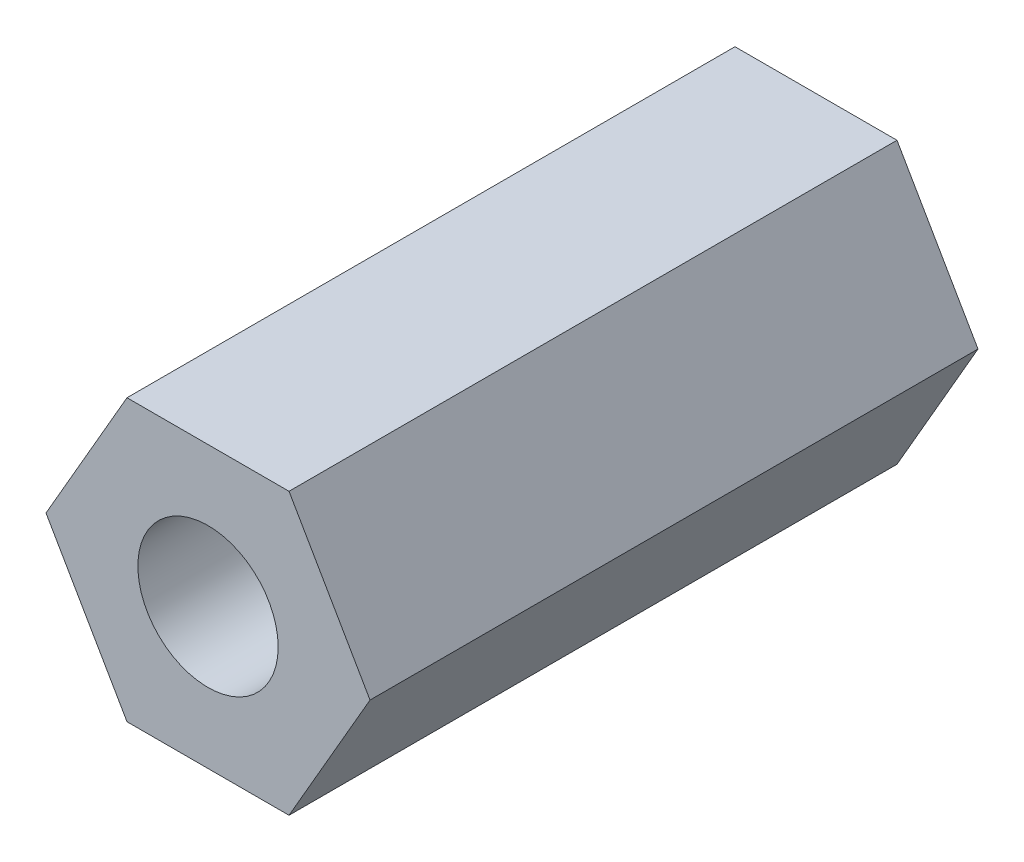
ISO-10303-21;
HEADER;
FILE_DESCRIPTION(('STEP AP214'),'2;1');
FILE_NAME('part.step','',(''),(''),'','','');
FILE_SCHEMA(('AUTOMOTIVE_DESIGN { 1 0 10303 214 1 1 1 1 }'));
ENDSEC;
DATA;
#1=APPLICATION_CONTEXT('core data for automotive mechanical design processes');
#2=APPLICATION_PROTOCOL_DEFINITION('international standard','automotive_design',2000,#1);
#3=PRODUCT_CONTEXT('',#1,'mechanical');
#4=PRODUCT('Part','Part','',(#3));
#5=PRODUCT_RELATED_PRODUCT_CATEGORY('part','',(#4));
#6=PRODUCT_DEFINITION_FORMATION('','',#4);
#7=PRODUCT_DEFINITION_CONTEXT('part definition',#1,'design');
#8=PRODUCT_DEFINITION('design','',#6,#7);
#9=PRODUCT_DEFINITION_SHAPE('','',#8);
#10=(LENGTH_UNIT() NAMED_UNIT(*) SI_UNIT(.MILLI.,.METRE.));
#11=(NAMED_UNIT(*) PLANE_ANGLE_UNIT() SI_UNIT($,.RADIAN.));
#12=(NAMED_UNIT(*) SI_UNIT($,.STERADIAN.) SOLID_ANGLE_UNIT());
#13=UNCERTAINTY_MEASURE_WITH_UNIT(LENGTH_MEASURE(1.E-05),#10,'distance_accuracy_value','');
#14=(GEOMETRIC_REPRESENTATION_CONTEXT(3) GLOBAL_UNCERTAINTY_ASSIGNED_CONTEXT((#13)) GLOBAL_UNIT_ASSIGNED_CONTEXT((#10,
#11,#12)) REPRESENTATION_CONTEXT('',''));
#15=CARTESIAN_POINT('',(0.,0.,0.));
#16=DIRECTION('',(0.,0.,1.));
#17=DIRECTION('',(1.,0.,0.));
#18=AXIS2_PLACEMENT_3D('',#15,#16,#17);
#19=CARTESIAN_POINT('',(-1.73205080756888,-3.,13.));
#20=DIRECTION('',(0.866025403784438,-0.5,0.));
#21=DIRECTION('',(0.5,0.866025403784439,0.));
#22=AXIS2_PLACEMENT_3D('',#19,#20,#21);
#23=PLANE('',#22);
#24=DIRECTION('',(-0.5,-0.866025403784439,0.));
#25=VECTOR('',#24,1.);
#26=CARTESIAN_POINT('',(-1.73205080756888,-3.,0.));
#27=LINE('',#26,#25);
#28=CARTESIAN_POINT('',(0.,0.,0.));
#29=VERTEX_POINT('',#28);
#30=CARTESIAN_POINT('',(-1.73205080756888,-3.,0.));
#31=VERTEX_POINT('',#30);
#32=EDGE_CURVE('E118',#29,#31,#27,.T.);
#33=ORIENTED_EDGE('',*,*,#32,.T.);
#34=DIRECTION('',(0.,0.,-1.));
#35=VECTOR('',#34,1.);
#36=CARTESIAN_POINT('',(-1.73205080756888,-3.,13.));
#37=LINE('',#36,#35);
#38=CARTESIAN_POINT('',(-1.73205080756888,-3.,13.));
#39=VERTEX_POINT('',#38);
#40=EDGE_CURVE('E11',#39,#31,#37,.T.);
#41=ORIENTED_EDGE('',*,*,#40,.F.);
#42=DIRECTION('',(-0.5,-0.866025403784439,0.));
#43=VECTOR('',#42,1.);
#44=CARTESIAN_POINT('',(-1.73205080756888,-3.,13.));
#45=LINE('',#44,#43);
#46=CARTESIAN_POINT('',(0.,0.,13.));
#47=VERTEX_POINT('',#46);
#48=EDGE_CURVE('E129',#47,#39,#45,.T.);
#49=ORIENTED_EDGE('',*,*,#48,.F.);
#50=DIRECTION('',(0.,0.,-1.));
#51=VECTOR('',#50,1.);
#52=CARTESIAN_POINT('',(0.,0.,13.));
#53=LINE('',#52,#51);
#54=EDGE_CURVE('E114',#47,#29,#53,.T.);
#55=ORIENTED_EDGE('',*,*,#54,.T.);
#56=EDGE_LOOP('',(#33,#41,#49,#55));
#57=FACE_BOUND('',#56,.T.);
#58=ADVANCED_FACE('F34',(#57),#23,.F.);
#59=CARTESIAN_POINT('',(0.,-6.,13.));
#60=DIRECTION('',(0.866025403784439,0.5,0.));
#61=DIRECTION('',(-0.5,0.866025403784439,0.));
#62=AXIS2_PLACEMENT_3D('',#59,#60,#61);
#63=PLANE('',#62);
#64=DIRECTION('',(0.5,-0.866025403784439,0.));
#65=VECTOR('',#64,1.);
#66=CARTESIAN_POINT('',(0.,-6.,0.));
#67=LINE('',#66,#65);
#68=CARTESIAN_POINT('',(0.,-6.,0.));
#69=VERTEX_POINT('',#68);
#70=EDGE_CURVE('E121',#31,#69,#67,.T.);
#71=ORIENTED_EDGE('',*,*,#70,.T.);
#72=DIRECTION('',(0.,0.,-1.));
#73=VECTOR('',#72,1.);
#74=CARTESIAN_POINT('',(0.,-6.,13.));
#75=LINE('',#74,#73);
#76=CARTESIAN_POINT('',(0.,-6.,13.));
#77=VERTEX_POINT('',#76);
#78=EDGE_CURVE('E42',#77,#69,#75,.T.);
#79=ORIENTED_EDGE('',*,*,#78,.F.);
#80=DIRECTION('',(0.5,-0.866025403784439,0.));
#81=VECTOR('',#80,1.);
#82=CARTESIAN_POINT('',(0.,-6.,13.));
#83=LINE('',#82,#81);
#84=EDGE_CURVE('E87',#39,#77,#83,.T.);
#85=ORIENTED_EDGE('',*,*,#84,.F.);
#86=ORIENTED_EDGE('',*,*,#40,.T.);
#87=EDGE_LOOP('',(#71,#79,#85,#86));
#88=FACE_BOUND('',#87,.T.);
#89=ADVANCED_FACE('F154',(#88),#63,.F.);
#90=CARTESIAN_POINT('',(3.46410161513775,-6.,13.));
#91=DIRECTION('',(0.,1.,0.));
#92=DIRECTION('',(0.,0.,1.));
#93=AXIS2_PLACEMENT_3D('',#90,#91,#92);
#94=PLANE('',#93);
#95=DIRECTION('',(1.,0.,0.));
#96=VECTOR('',#95,1.);
#97=CARTESIAN_POINT('',(3.46410161513775,-6.,0.));
#98=LINE('',#97,#96);
#99=CARTESIAN_POINT('',(3.46410161513775,-6.,0.));
#100=VERTEX_POINT('',#99);
#101=EDGE_CURVE('E124',#69,#100,#98,.T.);
#102=ORIENTED_EDGE('',*,*,#101,.T.);
#103=DIRECTION('',(0.,0.,-1.));
#104=VECTOR('',#103,1.);
#105=CARTESIAN_POINT('',(3.46410161513775,-6.,13.));
#106=LINE('',#105,#104);
#107=CARTESIAN_POINT('',(3.46410161513775,-6.,13.));
#108=VERTEX_POINT('',#107);
#109=EDGE_CURVE('E109',#108,#100,#106,.T.);
#110=ORIENTED_EDGE('',*,*,#109,.F.);
#111=DIRECTION('',(1.,0.,0.));
#112=VECTOR('',#111,1.);
#113=CARTESIAN_POINT('',(3.46410161513775,-6.,13.));
#114=LINE('',#113,#112);
#115=EDGE_CURVE('E100',#77,#108,#114,.T.);
#116=ORIENTED_EDGE('',*,*,#115,.F.);
#117=ORIENTED_EDGE('',*,*,#78,.T.);
#118=EDGE_LOOP('',(#102,#110,#116,#117));
#119=FACE_BOUND('',#118,.T.);
#120=ADVANCED_FACE('F135',(#119),#94,.F.);
#121=CARTESIAN_POINT('',(5.19615242270663,-3.,13.));
#122=DIRECTION('',(-0.866025403784439,0.5,0.));
#123=DIRECTION('',(-0.5,-0.866025403784439,0.));
#124=AXIS2_PLACEMENT_3D('',#121,#122,#123);
#125=PLANE('',#124);
#126=DIRECTION('',(0.5,0.866025403784439,0.));
#127=VECTOR('',#126,1.);
#128=CARTESIAN_POINT('',(5.19615242270663,-3.,0.));
#129=LINE('',#128,#127);
#130=CARTESIAN_POINT('',(5.19615242270663,-3.,0.));
#131=VERTEX_POINT('',#130);
#132=EDGE_CURVE('E108',#100,#131,#129,.T.);
#133=ORIENTED_EDGE('',*,*,#132,.T.);
#134=DIRECTION('',(0.,0.,-1.));
#135=VECTOR('',#134,1.);
#136=CARTESIAN_POINT('',(5.19615242270663,-3.,13.));
#137=LINE('',#136,#135);
#138=CARTESIAN_POINT('',(5.19615242270663,-3.,13.));
#139=VERTEX_POINT('',#138);
#140=EDGE_CURVE('E105',#139,#131,#137,.T.);
#141=ORIENTED_EDGE('',*,*,#140,.F.);
#142=DIRECTION('',(0.5,0.866025403784439,0.));
#143=VECTOR('',#142,1.);
#144=CARTESIAN_POINT('',(5.19615242270663,-3.,13.));
#145=LINE('',#144,#143);
#146=EDGE_CURVE('E94',#108,#139,#145,.T.);
#147=ORIENTED_EDGE('',*,*,#146,.F.);
#148=ORIENTED_EDGE('',*,*,#109,.T.);
#149=EDGE_LOOP('',(#133,#141,#147,#148));
#150=FACE_BOUND('',#149,.T.);
#151=ADVANCED_FACE('F106',(#150),#125,.F.);
#152=CARTESIAN_POINT('',(3.46410161513775,0.,13.));
#153=DIRECTION('',(-0.866025403784439,-0.5,0.));
#154=DIRECTION('',(0.5,-0.866025403784439,0.));
#155=AXIS2_PLACEMENT_3D('',#152,#153,#154);
#156=PLANE('',#155);
#157=DIRECTION('',(-0.5,0.866025403784439,0.));
#158=VECTOR('',#157,1.);
#159=CARTESIAN_POINT('',(3.46410161513775,0.,0.));
#160=LINE('',#159,#158);
#161=CARTESIAN_POINT('',(3.46410161513775,0.,0.));
#162=VERTEX_POINT('',#161);
#163=EDGE_CURVE('E73',#131,#162,#160,.T.);
#164=ORIENTED_EDGE('',*,*,#163,.T.);
#165=DIRECTION('',(0.,0.,-1.));
#166=VECTOR('',#165,1.);
#167=CARTESIAN_POINT('',(3.46410161513775,0.,13.));
#168=LINE('',#167,#166);
#169=CARTESIAN_POINT('',(3.46410161513775,0.,13.));
#170=VERTEX_POINT('',#169);
#171=EDGE_CURVE('E110',#170,#162,#168,.T.);
#172=ORIENTED_EDGE('',*,*,#171,.F.);
#173=DIRECTION('',(-0.5,0.866025403784439,0.));
#174=VECTOR('',#173,1.);
#175=CARTESIAN_POINT('',(3.46410161513775,0.,13.));
#176=LINE('',#175,#174);
#177=EDGE_CURVE('E98',#139,#170,#176,.T.);
#178=ORIENTED_EDGE('',*,*,#177,.F.);
#179=ORIENTED_EDGE('',*,*,#140,.T.);
#180=EDGE_LOOP('',(#164,#172,#178,#179));
#181=FACE_BOUND('',#180,.T.);
#182=ADVANCED_FACE('F112',(#181),#156,.F.);
#183=CARTESIAN_POINT('',(0.,0.,13.));
#184=DIRECTION('',(0.,-1.,0.));
#185=DIRECTION('',(1.,0.,0.));
#186=AXIS2_PLACEMENT_3D('',#183,#184,#185);
#187=PLANE('',#186);
#188=DIRECTION('',(-1.,0.,0.));
#189=VECTOR('',#188,1.);
#190=CARTESIAN_POINT('',(0.,0.,0.));
#191=LINE('',#190,#189);
#192=EDGE_CURVE('E79',#162,#29,#191,.T.);
#193=ORIENTED_EDGE('',*,*,#192,.T.);
#194=ORIENTED_EDGE('',*,*,#54,.F.);
#195=DIRECTION('',(-1.,0.,0.));
#196=VECTOR('',#195,1.);
#197=CARTESIAN_POINT('',(0.,0.,13.));
#198=LINE('',#197,#196);
#199=EDGE_CURVE('E50',#170,#47,#198,.T.);
#200=ORIENTED_EDGE('',*,*,#199,.F.);
#201=ORIENTED_EDGE('',*,*,#171,.T.);
#202=EDGE_LOOP('',(#193,#194,#200,#201));
#203=FACE_BOUND('',#202,.T.);
#204=ADVANCED_FACE('F142',(#203),#187,.F.);
#205=CARTESIAN_POINT('',(0.,0.,13.));
#206=DIRECTION('',(0.,0.,-1.));
#207=DIRECTION('',(-1.,0.,0.));
#208=AXIS2_PLACEMENT_3D('',#205,#206,#207);
#209=PLANE('',#208);
#210=CARTESIAN_POINT('',(1.73205080756888,-3.,13.));
#211=DIRECTION('',(0.,0.,1.));
#212=DIRECTION('',(1.,0.,0.));
#213=AXIS2_PLACEMENT_3D('',#210,#211,#212);
#214=CIRCLE('',#213,1.5);
#215=CARTESIAN_POINT('',(3.23205080756888,-3.,13.));
#216=VERTEX_POINT('',#215);
#217=EDGE_CURVE('E209',#216,#216,#214,.T.);
#218=ORIENTED_EDGE('',*,*,#217,.F.);
#219=EDGE_LOOP('',(#218));
#220=FACE_BOUND('',#219,.T.);
#221=ORIENTED_EDGE('',*,*,#48,.T.);
#222=ORIENTED_EDGE('',*,*,#84,.T.);
#223=ORIENTED_EDGE('',*,*,#115,.T.);
#224=ORIENTED_EDGE('',*,*,#146,.T.);
#225=ORIENTED_EDGE('',*,*,#177,.T.);
#226=ORIENTED_EDGE('',*,*,#199,.T.);
#227=EDGE_LOOP('',(#221,#222,#223,#224,#225,#226));
#228=FACE_BOUND('',#227,.T.);
#229=ADVANCED_FACE('F96',(#220,#228),#209,.F.);
#230=CARTESIAN_POINT('',(0.,0.,0.));
#231=DIRECTION('',(0.,0.,-1.));
#232=DIRECTION('',(-1.,0.,0.));
#233=AXIS2_PLACEMENT_3D('',#230,#231,#232);
#234=PLANE('',#233);
#235=CARTESIAN_POINT('',(1.73205080756888,-3.,0.));
#236=DIRECTION('',(0.,0.,1.));
#237=DIRECTION('',(1.,0.,0.));
#238=AXIS2_PLACEMENT_3D('',#235,#236,#237);
#239=CIRCLE('',#238,1.5);
#240=CARTESIAN_POINT('',(3.23205080756888,-3.,0.));
#241=VERTEX_POINT('',#240);
#242=EDGE_CURVE('E122',#241,#241,#239,.T.);
#243=ORIENTED_EDGE('',*,*,#242,.T.);
#244=EDGE_LOOP('',(#243));
#245=FACE_BOUND('',#244,.T.);
#246=ORIENTED_EDGE('',*,*,#32,.F.);
#247=ORIENTED_EDGE('',*,*,#192,.F.);
#248=ORIENTED_EDGE('',*,*,#163,.F.);
#249=ORIENTED_EDGE('',*,*,#132,.F.);
#250=ORIENTED_EDGE('',*,*,#101,.F.);
#251=ORIENTED_EDGE('',*,*,#70,.F.);
#252=EDGE_LOOP('',(#246,#247,#248,#249,#250,#251));
#253=FACE_BOUND('',#252,.T.);
#254=ADVANCED_FACE('F138',(#245,#253),#234,.T.);
#255=CARTESIAN_POINT('',(1.73205080756888,-3.,0.));
#256=DIRECTION('',(0.,0.,1.));
#257=DIRECTION('',(1.,0.,0.));
#258=AXIS2_PLACEMENT_3D('',#255,#256,#257);
#259=CYLINDRICAL_SURFACE('',#258,1.5);
#260=CARTESIAN_POINT('',(3.23205080756888,-3.,0.));
#261=CARTESIAN_POINT('',(3.23205080756888,-3.,0.135416666666666));
#262=CARTESIAN_POINT('',(3.23205080756888,-3.,0.270833333333333));
#263=CARTESIAN_POINT('',(3.23205080756888,-3.,0.541666666666667));
#264=CARTESIAN_POINT('',(3.23205080756888,-3.,0.677083333333333));
#265=CARTESIAN_POINT('',(3.23205080756888,-3.,0.947916666666667));
#266=CARTESIAN_POINT('',(3.23205080756888,-3.,1.08333333333333));
#267=CARTESIAN_POINT('',(3.23205080756888,-3.,1.35416666666667));
#268=CARTESIAN_POINT('',(3.23205080756888,-3.,1.48958333333333));
#269=CARTESIAN_POINT('',(3.23205080756888,-3.,1.76041666666667));
#270=CARTESIAN_POINT('',(3.23205080756888,-3.,1.89583333333333));
#271=CARTESIAN_POINT('',(3.23205080756888,-3.,2.16666666666667));
#272=CARTESIAN_POINT('',(3.23205080756888,-3.,2.30208333333333));
#273=CARTESIAN_POINT('',(3.23205080756888,-3.,2.57291666666667));
#274=CARTESIAN_POINT('',(3.23205080756888,-3.,2.70833333333333));
#275=CARTESIAN_POINT('',(3.23205080756888,-3.,2.97916666666667));
#276=CARTESIAN_POINT('',(3.23205080756888,-3.,3.11458333333333));
#277=CARTESIAN_POINT('',(3.23205080756888,-3.,3.38541666666667));
#278=CARTESIAN_POINT('',(3.23205080756888,-3.,3.52083333333333));
#279=CARTESIAN_POINT('',(3.23205080756888,-3.,3.79166666666667));
#280=CARTESIAN_POINT('',(3.23205080756888,-3.,3.92708333333333));
#281=CARTESIAN_POINT('',(3.23205080756888,-3.,4.19791666666667));
#282=CARTESIAN_POINT('',(3.23205080756888,-3.,4.33333333333333));
#283=CARTESIAN_POINT('',(3.23205080756888,-3.,4.60416666666667));
#284=CARTESIAN_POINT('',(3.23205080756888,-3.,4.73958333333333));
#285=CARTESIAN_POINT('',(3.23205080756888,-3.,5.01041666666667));
#286=CARTESIAN_POINT('',(3.23205080756888,-3.,5.14583333333333));
#287=CARTESIAN_POINT('',(3.23205080756888,-3.,5.41666666666667));
#288=CARTESIAN_POINT('',(3.23205080756888,-3.,5.55208333333333));
#289=CARTESIAN_POINT('',(3.23205080756888,-3.,5.82291666666667));
#290=CARTESIAN_POINT('',(3.23205080756888,-3.,5.95833333333333));
#291=CARTESIAN_POINT('',(3.23205080756888,-3.,6.22916666666667));
#292=CARTESIAN_POINT('',(3.23205080756888,-3.,6.36458333333333));
#293=CARTESIAN_POINT('',(3.23205080756888,-3.,6.63541666666667));
#294=CARTESIAN_POINT('',(3.23205080756888,-3.,6.77083333333333));
#295=CARTESIAN_POINT('',(3.23205080756888,-3.,7.04166666666667));
#296=CARTESIAN_POINT('',(3.23205080756888,-3.,7.17708333333333));
#297=CARTESIAN_POINT('',(3.23205080756888,-3.,7.44791666666667));
#298=CARTESIAN_POINT('',(3.23205080756888,-3.,7.58333333333333));
#299=CARTESIAN_POINT('',(3.23205080756888,-3.,7.85416666666667));
#300=CARTESIAN_POINT('',(3.23205080756888,-3.,7.98958333333333));
#301=CARTESIAN_POINT('',(3.23205080756888,-3.,8.26041666666667));
#302=CARTESIAN_POINT('',(3.23205080756888,-3.,8.39583333333333));
#303=CARTESIAN_POINT('',(3.23205080756888,-3.,8.66666666666667));
#304=CARTESIAN_POINT('',(3.23205080756888,-3.,8.80208333333333));
#305=CARTESIAN_POINT('',(3.23205080756888,-3.,9.07291666666667));
#306=CARTESIAN_POINT('',(3.23205080756888,-3.,9.20833333333333));
#307=CARTESIAN_POINT('',(3.23205080756888,-3.,9.47916666666667));
#308=CARTESIAN_POINT('',(3.23205080756888,-3.,9.61458333333333));
#309=CARTESIAN_POINT('',(3.23205080756888,-3.,9.88541666666667));
#310=CARTESIAN_POINT('',(3.23205080756888,-3.,10.0208333333333));
#311=CARTESIAN_POINT('',(3.23205080756888,-3.,10.2916666666667));
#312=CARTESIAN_POINT('',(3.23205080756888,-3.,10.4270833333333));
#313=CARTESIAN_POINT('',(3.23205080756888,-3.,10.6979166666667));
#314=CARTESIAN_POINT('',(3.23205080756888,-3.,10.8333333333333));
#315=CARTESIAN_POINT('',(3.23205080756888,-3.,11.1041666666667));
#316=CARTESIAN_POINT('',(3.23205080756888,-3.,11.2395833333333));
#317=CARTESIAN_POINT('',(3.23205080756888,-3.,11.5104166666667));
#318=CARTESIAN_POINT('',(3.23205080756888,-3.,11.6458333333333));
#319=CARTESIAN_POINT('',(3.23205080756888,-3.,11.9166666666667));
#320=CARTESIAN_POINT('',(3.23205080756888,-3.,12.0520833333333));
#321=CARTESIAN_POINT('',(3.23205080756888,-3.,12.3229166666667));
#322=CARTESIAN_POINT('',(3.23205080756888,-3.,12.4583333333333));
#323=CARTESIAN_POINT('',(3.23205080756888,-3.,12.7291666666667));
#324=CARTESIAN_POINT('',(3.23205080756888,-3.,12.8645833333333));
#325=CARTESIAN_POINT('',(3.23205080756888,-3.,13.));
#326=B_SPLINE_CURVE_WITH_KNOTS('',3,(#260,#261,#262,#263,#264,#265,#266,#267,#268,#269,#270,
#271,#272,#273,#274,#275,#276,#277,#278,#279,#280,#281,#282,#283,#284,#285,#286,#287,#288,#289,
#290,#291,#292,#293,#294,#295,#296,#297,#298,#299,#300,#301,#302,#303,#304,#305,#306,#307,#308,
#309,#310,#311,#312,#313,#314,#315,#316,#317,#318,#319,#320,#321,#322,#323,#324,#325),
.UNSPECIFIED.,.F.,.F.,(4,2,2,2,2,2,2,2,2,2,2,2,2,2,2,2,2,2,2,2,2,2,2,2,2,2,2,2,2,2,2,2,4),(0.,
0.40625,0.8125,1.21875,1.625,2.03125,2.4375,2.84375,3.25,3.65625,4.0625,4.46875,4.875,5.28125,
5.6875,6.09375,6.5,6.90625,7.3125,7.71875,8.125,8.53125,8.9375,9.34375,9.75,10.15625,10.5625,
10.96875,11.375,11.78125,12.1875,12.59375,13.),.UNSPECIFIED.);
#327=EDGE_CURVE('BSEAM191',#241,#216,#326,.T.);
#328=ORIENTED_EDGE('',*,*,#242,.F.);
#329=ORIENTED_EDGE('',*,*,#217,.T.);
#330=ORIENTED_EDGE('',*,*,#327,.T.);
#331=ORIENTED_EDGE('',*,*,#327,.F.);
#332=EDGE_LOOP('',(#328,#330,#329,#331));
#333=FACE_BOUND('',#332,.T.);
#334=ADVANCED_FACE('F191',(#333),#259,.F.);
#335=CLOSED_SHELL('',(#58,#89,#120,#151,#182,#204,#229,#254,#334));
#336=MANIFOLD_SOLID_BREP('B2',#335);
#337=ADVANCED_BREP_SHAPE_REPRESENTATION('',(#18,#336),#14);
#338=SHAPE_DEFINITION_REPRESENTATION(#9,#337);
ENDSEC;
END-ISO-10303-21;
